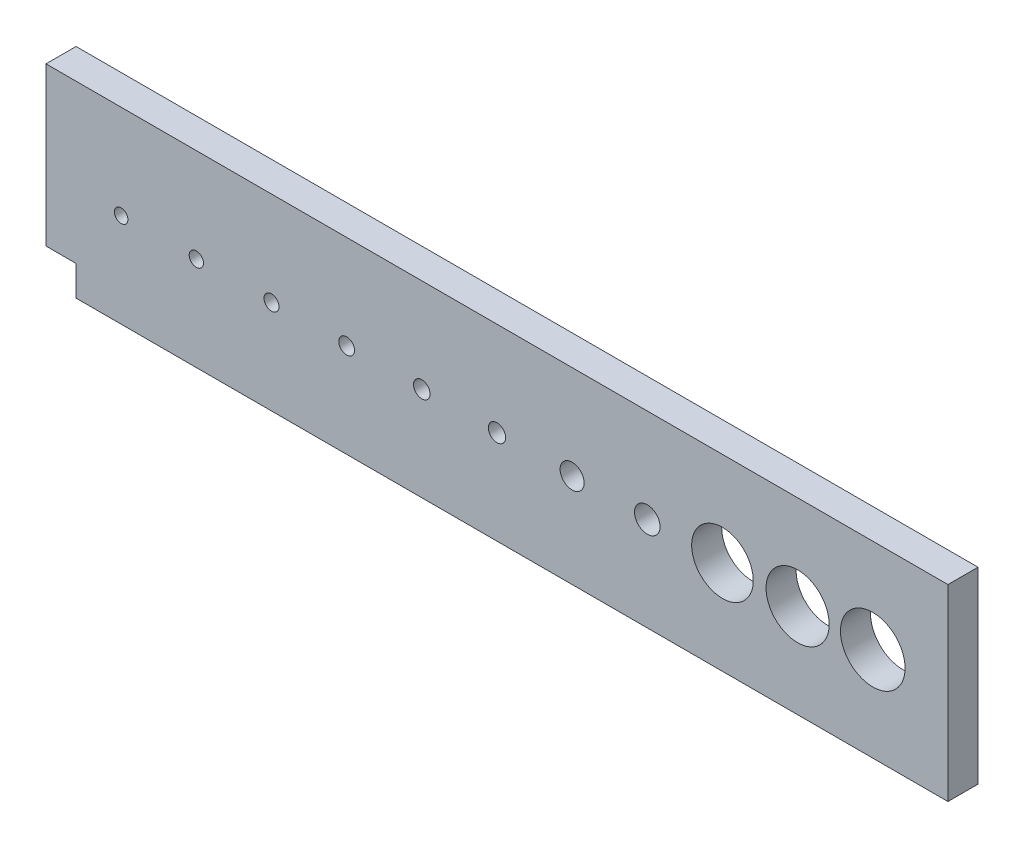
ISO-10303-21;
HEADER;
FILE_DESCRIPTION(('STEP AP214'),'2;1');
FILE_NAME('part.step','',(''),(''),'','','');
FILE_SCHEMA(('AUTOMOTIVE_DESIGN { 1 0 10303 214 1 1 1 1 }'));
ENDSEC;
DATA;
#1=APPLICATION_CONTEXT('core data for automotive mechanical design processes');
#2=APPLICATION_PROTOCOL_DEFINITION('international standard','automotive_design',2000,#1);
#3=PRODUCT_CONTEXT('',#1,'mechanical');
#4=PRODUCT('Part','Part','',(#3));
#5=PRODUCT_RELATED_PRODUCT_CATEGORY('part','',(#4));
#6=PRODUCT_DEFINITION_FORMATION('','',#4);
#7=PRODUCT_DEFINITION_CONTEXT('part definition',#1,'design');
#8=PRODUCT_DEFINITION('design','',#6,#7);
#9=PRODUCT_DEFINITION_SHAPE('','',#8);
#10=(LENGTH_UNIT() NAMED_UNIT(*) SI_UNIT(.MILLI.,.METRE.));
#11=(NAMED_UNIT(*) PLANE_ANGLE_UNIT() SI_UNIT($,.RADIAN.));
#12=(NAMED_UNIT(*) SI_UNIT($,.STERADIAN.) SOLID_ANGLE_UNIT());
#13=UNCERTAINTY_MEASURE_WITH_UNIT(LENGTH_MEASURE(1.E-05),#10,'distance_accuracy_value','');
#14=(GEOMETRIC_REPRESENTATION_CONTEXT(3) GLOBAL_UNCERTAINTY_ASSIGNED_CONTEXT((#13)) GLOBAL_UNIT_ASSIGNED_CONTEXT((#10,
#11,#12)) REPRESENTATION_CONTEXT('',''));
#15=CARTESIAN_POINT('',(0.,0.,0.));
#16=DIRECTION('',(0.,0.,1.));
#17=DIRECTION('',(1.,0.,0.));
#18=AXIS2_PLACEMENT_3D('',#15,#16,#17);
#19=CARTESIAN_POINT('',(-60.,-12.5,4.));
#20=DIRECTION('',(1.,0.,0.));
#21=DIRECTION('',(0.,0.,-1.));
#22=AXIS2_PLACEMENT_3D('',#19,#20,#21);
#23=PLANE('',#22);
#24=DIRECTION('',(0.,0.,-1.));
#25=VECTOR('',#24,1.);
#26=CARTESIAN_POINT('',(-60.,-8.5,4.1));
#27=LINE('',#26,#25);
#28=CARTESIAN_POINT('',(-60.,-8.5,4.));
#29=VERTEX_POINT('',#28);
#30=CARTESIAN_POINT('',(-60.,-8.5,0.));
#31=VERTEX_POINT('',#30);
#32=EDGE_CURVE('E57',#29,#31,#27,.T.);
#33=ORIENTED_EDGE('',*,*,#32,.F.);
#34=DIRECTION('',(0.,-1.,0.));
#35=VECTOR('',#34,1.);
#36=CARTESIAN_POINT('',(-60.,-12.5,4.));
#37=LINE('',#36,#35);
#38=CARTESIAN_POINT('',(-60.,12.5,4.));
#39=VERTEX_POINT('',#38);
#40=EDGE_CURVE('E114',#39,#29,#37,.T.);
#41=ORIENTED_EDGE('',*,*,#40,.F.);
#42=DIRECTION('',(0.,0.,-1.));
#43=VECTOR('',#42,1.);
#44=CARTESIAN_POINT('',(-60.,12.5,4.));
#45=LINE('',#44,#43);
#46=CARTESIAN_POINT('',(-60.,12.5,0.));
#47=VERTEX_POINT('',#46);
#48=EDGE_CURVE('E130',#39,#47,#45,.T.);
#49=ORIENTED_EDGE('',*,*,#48,.T.);
#50=DIRECTION('',(0.,-1.,0.));
#51=VECTOR('',#50,1.);
#52=CARTESIAN_POINT('',(-60.,-12.5,0.));
#53=LINE('',#52,#51);
#54=EDGE_CURVE('E116',#47,#31,#53,.T.);
#55=ORIENTED_EDGE('',*,*,#54,.T.);
#56=EDGE_LOOP('',(#33,#41,#49,#55));
#57=FACE_BOUND('',#56,.T.);
#58=ADVANCED_FACE('F43',(#57),#23,.F.);
#59=CARTESIAN_POINT('',(-60.,-12.5,4.));
#60=DIRECTION('',(0.,1.,0.));
#61=DIRECTION('',(0.,0.,1.));
#62=AXIS2_PLACEMENT_3D('',#59,#60,#61);
#63=PLANE('',#62);
#64=DIRECTION('',(0.,0.,-1.));
#65=VECTOR('',#64,1.);
#66=CARTESIAN_POINT('',(-56.,-12.5,4.1));
#67=LINE('',#66,#65);
#68=CARTESIAN_POINT('',(-56.,-12.5,4.));
#69=VERTEX_POINT('',#68);
#70=CARTESIAN_POINT('',(-56.,-12.5,0.));
#71=VERTEX_POINT('',#70);
#72=EDGE_CURVE('E109',#69,#71,#67,.T.);
#73=ORIENTED_EDGE('',*,*,#72,.T.);
#74=DIRECTION('',(1.,0.,0.));
#75=VECTOR('',#74,1.);
#76=CARTESIAN_POINT('',(-60.,-12.5,0.));
#77=LINE('',#76,#75);
#78=CARTESIAN_POINT('',(60.,-12.5,0.));
#79=VERTEX_POINT('',#78);
#80=EDGE_CURVE('E132',#71,#79,#77,.T.);
#81=ORIENTED_EDGE('',*,*,#80,.T.);
#82=DIRECTION('',(0.,0.,-1.));
#83=VECTOR('',#82,1.);
#84=CARTESIAN_POINT('',(60.,-12.5,4.));
#85=LINE('',#84,#83);
#86=CARTESIAN_POINT('',(60.,-12.5,4.));
#87=VERTEX_POINT('',#86);
#88=EDGE_CURVE('E138',#87,#79,#85,.T.);
#89=ORIENTED_EDGE('',*,*,#88,.F.);
#90=DIRECTION('',(1.,0.,0.));
#91=VECTOR('',#90,1.);
#92=CARTESIAN_POINT('',(-60.,-12.5,4.));
#93=LINE('',#92,#91);
#94=EDGE_CURVE('E88',#69,#87,#93,.T.);
#95=ORIENTED_EDGE('',*,*,#94,.F.);
#96=EDGE_LOOP('',(#73,#81,#89,#95));
#97=FACE_BOUND('',#96,.T.);
#98=ADVANCED_FACE('F217',(#97),#63,.F.);
#99=CARTESIAN_POINT('',(0.,0.,4.));
#100=DIRECTION('',(0.,0.,-1.));
#101=DIRECTION('',(-1.,0.,0.));
#102=AXIS2_PLACEMENT_3D('',#99,#100,#101);
#103=PLANE('',#102);
#104=CARTESIAN_POINT('',(-50.,0.,4.));
#105=DIRECTION('',(0.,0.,-1.));
#106=DIRECTION('',(-1.,0.,0.));
#107=AXIS2_PLACEMENT_3D('',#104,#105,#106);
#108=CIRCLE('',#107,0.899999999999997);
#109=CARTESIAN_POINT('',(-50.9,0.,4.));
#110=VERTEX_POINT('',#109);
#111=EDGE_CURVE('E125',#110,#110,#108,.F.);
#112=ORIENTED_EDGE('',*,*,#111,.F.);
#113=EDGE_LOOP('',(#112));
#114=FACE_BOUND('',#113,.T.);
#115=CARTESIAN_POINT('',(-40.,0.,4.));
#116=DIRECTION('',(0.,0.,-1.));
#117=DIRECTION('',(-1.,0.,0.));
#118=AXIS2_PLACEMENT_3D('',#115,#116,#117);
#119=CIRCLE('',#118,0.950000000000001);
#120=CARTESIAN_POINT('',(-40.95,0.,4.));
#121=VERTEX_POINT('',#120);
#122=EDGE_CURVE('E144',#121,#121,#119,.F.);
#123=ORIENTED_EDGE('',*,*,#122,.F.);
#124=EDGE_LOOP('',(#123));
#125=FACE_BOUND('',#124,.T.);
#126=CARTESIAN_POINT('',(-30.,0.,4.));
#127=DIRECTION('',(0.,0.,-1.));
#128=DIRECTION('',(-1.,0.,0.));
#129=AXIS2_PLACEMENT_3D('',#126,#127,#128);
#130=CIRCLE('',#129,1.);
#131=CARTESIAN_POINT('',(-31.,0.,4.));
#132=VERTEX_POINT('',#131);
#133=EDGE_CURVE('E148',#132,#132,#130,.F.);
#134=ORIENTED_EDGE('',*,*,#133,.F.);
#135=EDGE_LOOP('',(#134));
#136=FACE_BOUND('',#135,.T.);
#137=CARTESIAN_POINT('',(-20.,0.,4.));
#138=DIRECTION('',(0.,0.,-1.));
#139=DIRECTION('',(-1.,0.,0.));
#140=AXIS2_PLACEMENT_3D('',#137,#138,#139);
#141=CIRCLE('',#140,1.05);
#142=CARTESIAN_POINT('',(-21.05,0.,4.));
#143=VERTEX_POINT('',#142);
#144=EDGE_CURVE('E152',#143,#143,#141,.F.);
#145=ORIENTED_EDGE('',*,*,#144,.F.);
#146=EDGE_LOOP('',(#145));
#147=FACE_BOUND('',#146,.T.);
#148=CARTESIAN_POINT('',(-10.,0.,4.));
#149=DIRECTION('',(0.,0.,-1.));
#150=DIRECTION('',(-1.,0.,0.));
#151=AXIS2_PLACEMENT_3D('',#148,#149,#150);
#152=CIRCLE('',#151,1.1);
#153=CARTESIAN_POINT('',(-11.1,0.,4.));
#154=VERTEX_POINT('',#153);
#155=EDGE_CURVE('E156',#154,#154,#152,.F.);
#156=ORIENTED_EDGE('',*,*,#155,.F.);
#157=EDGE_LOOP('',(#156));
#158=FACE_BOUND('',#157,.T.);
#159=CARTESIAN_POINT('',(0.,0.,4.));
#160=DIRECTION('',(0.,0.,-1.));
#161=DIRECTION('',(-1.,0.,0.));
#162=AXIS2_PLACEMENT_3D('',#159,#160,#161);
#163=CIRCLE('',#162,1.15);
#164=CARTESIAN_POINT('',(-1.15,0.,4.));
#165=VERTEX_POINT('',#164);
#166=EDGE_CURVE('E160',#165,#165,#163,.F.);
#167=ORIENTED_EDGE('',*,*,#166,.F.);
#168=EDGE_LOOP('',(#167));
#169=FACE_BOUND('',#168,.T.);
#170=CARTESIAN_POINT('',(10.,0.,4.));
#171=DIRECTION('',(0.,0.,-1.));
#172=DIRECTION('',(-1.,0.,0.));
#173=AXIS2_PLACEMENT_3D('',#170,#171,#172);
#174=CIRCLE('',#173,1.6);
#175=CARTESIAN_POINT('',(8.4,0.,4.));
#176=VERTEX_POINT('',#175);
#177=EDGE_CURVE('E164',#176,#176,#174,.F.);
#178=ORIENTED_EDGE('',*,*,#177,.F.);
#179=EDGE_LOOP('',(#178));
#180=FACE_BOUND('',#179,.T.);
#181=CARTESIAN_POINT('',(20.,0.,4.));
#182=DIRECTION('',(0.,0.,-1.));
#183=DIRECTION('',(-1.,0.,0.));
#184=AXIS2_PLACEMENT_3D('',#181,#182,#183);
#185=CIRCLE('',#184,1.7);
#186=CARTESIAN_POINT('',(18.3,0.,4.));
#187=VERTEX_POINT('',#186);
#188=EDGE_CURVE('E168',#187,#187,#185,.F.);
#189=ORIENTED_EDGE('',*,*,#188,.F.);
#190=EDGE_LOOP('',(#189));
#191=FACE_BOUND('',#190,.T.);
#192=CARTESIAN_POINT('',(30.,0.,4.));
#193=DIRECTION('',(0.,0.,-1.));
#194=DIRECTION('',(-1.,0.,0.));
#195=AXIS2_PLACEMENT_3D('',#192,#193,#194);
#196=CIRCLE('',#195,4.1);
#197=CARTESIAN_POINT('',(25.9,0.,4.));
#198=VERTEX_POINT('',#197);
#199=EDGE_CURVE('E172',#198,#198,#196,.F.);
#200=ORIENTED_EDGE('',*,*,#199,.F.);
#201=EDGE_LOOP('',(#200));
#202=FACE_BOUND('',#201,.T.);
#203=CARTESIAN_POINT('',(40.,0.,4.));
#204=DIRECTION('',(0.,0.,-1.));
#205=DIRECTION('',(-1.,0.,0.));
#206=AXIS2_PLACEMENT_3D('',#203,#204,#205);
#207=CIRCLE('',#206,4.2);
#208=CARTESIAN_POINT('',(35.8,0.,4.));
#209=VERTEX_POINT('',#208);
#210=EDGE_CURVE('E176',#209,#209,#207,.F.);
#211=ORIENTED_EDGE('',*,*,#210,.F.);
#212=EDGE_LOOP('',(#211));
#213=FACE_BOUND('',#212,.T.);
#214=CARTESIAN_POINT('',(50.,0.,4.));
#215=DIRECTION('',(0.,0.,-1.));
#216=DIRECTION('',(-1.,0.,0.));
#217=AXIS2_PLACEMENT_3D('',#214,#215,#216);
#218=CIRCLE('',#217,4.3);
#219=CARTESIAN_POINT('',(45.7,0.,4.));
#220=VERTEX_POINT('',#219);
#221=EDGE_CURVE('E180',#220,#220,#218,.F.);
#222=ORIENTED_EDGE('',*,*,#221,.F.);
#223=EDGE_LOOP('',(#222));
#224=FACE_BOUND('',#223,.T.);
#225=DIRECTION('',(0.,1.,0.));
#226=VECTOR('',#225,1.);
#227=CARTESIAN_POINT('',(-56.,0.,4.));
#228=LINE('',#227,#226);
#229=CARTESIAN_POINT('',(-56.,-8.5,4.));
#230=VERTEX_POINT('',#229);
#231=EDGE_CURVE('E108',#69,#230,#228,.T.);
#232=ORIENTED_EDGE('',*,*,#231,.F.);
#233=ORIENTED_EDGE('',*,*,#94,.T.);
#234=DIRECTION('',(0.,1.,0.));
#235=VECTOR('',#234,1.);
#236=CARTESIAN_POINT('',(60.,-12.5,4.));
#237=LINE('',#236,#235);
#238=CARTESIAN_POINT('',(60.,12.5,4.));
#239=VERTEX_POINT('',#238);
#240=EDGE_CURVE('E120',#87,#239,#237,.T.);
#241=ORIENTED_EDGE('',*,*,#240,.T.);
#242=DIRECTION('',(-1.,0.,0.));
#243=VECTOR('',#242,1.);
#244=CARTESIAN_POINT('',(-60.,12.5,4.));
#245=LINE('',#244,#243);
#246=EDGE_CURVE('E66',#239,#39,#245,.T.);
#247=ORIENTED_EDGE('',*,*,#246,.T.);
#248=ORIENTED_EDGE('',*,*,#40,.T.);
#249=DIRECTION('',(-1.,0.,0.));
#250=VECTOR('',#249,1.);
#251=CARTESIAN_POINT('',(0.,-8.5,4.));
#252=LINE('',#251,#250);
#253=EDGE_CURVE('E104',#230,#29,#252,.T.);
#254=ORIENTED_EDGE('',*,*,#253,.F.);
#255=EDGE_LOOP('',(#232,#233,#241,#247,#248,#254));
#256=FACE_BOUND('',#255,.T.);
#257=ADVANCED_FACE('F118',(#114,#125,#136,#147,#158,#169,#180,#191,#202,#213,#224,#256),#103,.F.);
#258=CARTESIAN_POINT('',(0.,0.,0.));
#259=DIRECTION('',(0.,0.,-1.));
#260=DIRECTION('',(-1.,0.,0.));
#261=AXIS2_PLACEMENT_3D('',#258,#259,#260);
#262=PLANE('',#261);
#263=CARTESIAN_POINT('',(50.,0.,0.));
#264=DIRECTION('',(0.,0.,-1.));
#265=DIRECTION('',(-1.,0.,0.));
#266=AXIS2_PLACEMENT_3D('',#263,#264,#265);
#267=CIRCLE('',#266,4.3);
#268=CARTESIAN_POINT('',(45.7,0.,0.));
#269=VERTEX_POINT('',#268);
#270=EDGE_CURVE('E181',#269,#269,#267,.F.);
#271=ORIENTED_EDGE('',*,*,#270,.T.);
#272=EDGE_LOOP('',(#271));
#273=FACE_BOUND('',#272,.T.);
#274=CARTESIAN_POINT('',(40.,0.,0.));
#275=DIRECTION('',(0.,0.,-1.));
#276=DIRECTION('',(-1.,0.,0.));
#277=AXIS2_PLACEMENT_3D('',#274,#275,#276);
#278=CIRCLE('',#277,4.2);
#279=CARTESIAN_POINT('',(35.8,0.,0.));
#280=VERTEX_POINT('',#279);
#281=EDGE_CURVE('E177',#280,#280,#278,.F.);
#282=ORIENTED_EDGE('',*,*,#281,.T.);
#283=EDGE_LOOP('',(#282));
#284=FACE_BOUND('',#283,.T.);
#285=CARTESIAN_POINT('',(30.,0.,0.));
#286=DIRECTION('',(0.,0.,-1.));
#287=DIRECTION('',(-1.,0.,0.));
#288=AXIS2_PLACEMENT_3D('',#285,#286,#287);
#289=CIRCLE('',#288,4.1);
#290=CARTESIAN_POINT('',(25.9,0.,0.));
#291=VERTEX_POINT('',#290);
#292=EDGE_CURVE('E173',#291,#291,#289,.F.);
#293=ORIENTED_EDGE('',*,*,#292,.T.);
#294=EDGE_LOOP('',(#293));
#295=FACE_BOUND('',#294,.T.);
#296=CARTESIAN_POINT('',(20.,0.,0.));
#297=DIRECTION('',(0.,0.,-1.));
#298=DIRECTION('',(-1.,0.,0.));
#299=AXIS2_PLACEMENT_3D('',#296,#297,#298);
#300=CIRCLE('',#299,1.7);
#301=CARTESIAN_POINT('',(18.3,0.,0.));
#302=VERTEX_POINT('',#301);
#303=EDGE_CURVE('E169',#302,#302,#300,.F.);
#304=ORIENTED_EDGE('',*,*,#303,.T.);
#305=EDGE_LOOP('',(#304));
#306=FACE_BOUND('',#305,.T.);
#307=CARTESIAN_POINT('',(10.,0.,0.));
#308=DIRECTION('',(0.,0.,-1.));
#309=DIRECTION('',(-1.,0.,0.));
#310=AXIS2_PLACEMENT_3D('',#307,#308,#309);
#311=CIRCLE('',#310,1.6);
#312=CARTESIAN_POINT('',(8.4,0.,0.));
#313=VERTEX_POINT('',#312);
#314=EDGE_CURVE('E165',#313,#313,#311,.F.);
#315=ORIENTED_EDGE('',*,*,#314,.T.);
#316=EDGE_LOOP('',(#315));
#317=FACE_BOUND('',#316,.T.);
#318=CARTESIAN_POINT('',(0.,0.,0.));
#319=DIRECTION('',(0.,0.,-1.));
#320=DIRECTION('',(-1.,0.,0.));
#321=AXIS2_PLACEMENT_3D('',#318,#319,#320);
#322=CIRCLE('',#321,1.15);
#323=CARTESIAN_POINT('',(-1.15,0.,0.));
#324=VERTEX_POINT('',#323);
#325=EDGE_CURVE('E161',#324,#324,#322,.F.);
#326=ORIENTED_EDGE('',*,*,#325,.T.);
#327=EDGE_LOOP('',(#326));
#328=FACE_BOUND('',#327,.T.);
#329=CARTESIAN_POINT('',(-10.,0.,0.));
#330=DIRECTION('',(0.,0.,-1.));
#331=DIRECTION('',(-1.,0.,0.));
#332=AXIS2_PLACEMENT_3D('',#329,#330,#331);
#333=CIRCLE('',#332,1.1);
#334=CARTESIAN_POINT('',(-11.1,0.,0.));
#335=VERTEX_POINT('',#334);
#336=EDGE_CURVE('E157',#335,#335,#333,.F.);
#337=ORIENTED_EDGE('',*,*,#336,.T.);
#338=EDGE_LOOP('',(#337));
#339=FACE_BOUND('',#338,.T.);
#340=CARTESIAN_POINT('',(-20.,0.,0.));
#341=DIRECTION('',(0.,0.,-1.));
#342=DIRECTION('',(-1.,0.,0.));
#343=AXIS2_PLACEMENT_3D('',#340,#341,#342);
#344=CIRCLE('',#343,1.05);
#345=CARTESIAN_POINT('',(-21.05,0.,0.));
#346=VERTEX_POINT('',#345);
#347=EDGE_CURVE('E153',#346,#346,#344,.F.);
#348=ORIENTED_EDGE('',*,*,#347,.T.);
#349=EDGE_LOOP('',(#348));
#350=FACE_BOUND('',#349,.T.);
#351=CARTESIAN_POINT('',(-30.,0.,0.));
#352=DIRECTION('',(0.,0.,-1.));
#353=DIRECTION('',(-1.,0.,0.));
#354=AXIS2_PLACEMENT_3D('',#351,#352,#353);
#355=CIRCLE('',#354,1.);
#356=CARTESIAN_POINT('',(-31.,0.,0.));
#357=VERTEX_POINT('',#356);
#358=EDGE_CURVE('E149',#357,#357,#355,.F.);
#359=ORIENTED_EDGE('',*,*,#358,.T.);
#360=EDGE_LOOP('',(#359));
#361=FACE_BOUND('',#360,.T.);
#362=CARTESIAN_POINT('',(-40.,0.,0.));
#363=DIRECTION('',(0.,0.,-1.));
#364=DIRECTION('',(-1.,0.,0.));
#365=AXIS2_PLACEMENT_3D('',#362,#363,#364);
#366=CIRCLE('',#365,0.950000000000001);
#367=CARTESIAN_POINT('',(-40.95,0.,0.));
#368=VERTEX_POINT('',#367);
#369=EDGE_CURVE('E145',#368,#368,#366,.F.);
#370=ORIENTED_EDGE('',*,*,#369,.T.);
#371=EDGE_LOOP('',(#370));
#372=FACE_BOUND('',#371,.T.);
#373=CARTESIAN_POINT('',(-50.,0.,0.));
#374=DIRECTION('',(0.,0.,-1.));
#375=DIRECTION('',(-1.,0.,0.));
#376=AXIS2_PLACEMENT_3D('',#373,#374,#375);
#377=CIRCLE('',#376,0.899999999999997);
#378=CARTESIAN_POINT('',(-50.9,0.,0.));
#379=VERTEX_POINT('',#378);
#380=EDGE_CURVE('E141',#379,#379,#377,.F.);
#381=ORIENTED_EDGE('',*,*,#380,.T.);
#382=EDGE_LOOP('',(#381));
#383=FACE_BOUND('',#382,.T.);
#384=ORIENTED_EDGE('',*,*,#80,.F.);
#385=DIRECTION('',(0.,1.,0.));
#386=VECTOR('',#385,1.);
#387=CARTESIAN_POINT('',(-56.,0.,0.));
#388=LINE('',#387,#386);
#389=CARTESIAN_POINT('',(-56.,-8.5,0.));
#390=VERTEX_POINT('',#389);
#391=EDGE_CURVE('E11',#71,#390,#388,.T.);
#392=ORIENTED_EDGE('',*,*,#391,.T.);
#393=DIRECTION('',(-1.,0.,0.));
#394=VECTOR('',#393,1.);
#395=CARTESIAN_POINT('',(0.,-8.5,0.));
#396=LINE('',#395,#394);
#397=EDGE_CURVE('E50',#390,#31,#396,.T.);
#398=ORIENTED_EDGE('',*,*,#397,.T.);
#399=ORIENTED_EDGE('',*,*,#54,.F.);
#400=DIRECTION('',(-1.,0.,0.));
#401=VECTOR('',#400,1.);
#402=CARTESIAN_POINT('',(-60.,12.5,0.));
#403=LINE('',#402,#401);
#404=CARTESIAN_POINT('',(60.,12.5,0.));
#405=VERTEX_POINT('',#404);
#406=EDGE_CURVE('E83',#405,#47,#403,.T.);
#407=ORIENTED_EDGE('',*,*,#406,.F.);
#408=DIRECTION('',(0.,1.,0.));
#409=VECTOR('',#408,1.);
#410=CARTESIAN_POINT('',(60.,-12.5,0.));
#411=LINE('',#410,#409);
#412=EDGE_CURVE('E122',#79,#405,#411,.T.);
#413=ORIENTED_EDGE('',*,*,#412,.F.);
#414=EDGE_LOOP('',(#384,#392,#398,#399,#407,#413));
#415=FACE_BOUND('',#414,.T.);
#416=ADVANCED_FACE('F185',(#273,#284,#295,#306,#317,#328,#339,#350,#361,#372,#383,#415),#262,.T.);
#417=CARTESIAN_POINT('',(60.,-12.5,4.));
#418=DIRECTION('',(-1.,0.,0.));
#419=DIRECTION('',(0.,0.,1.));
#420=AXIS2_PLACEMENT_3D('',#417,#418,#419);
#421=PLANE('',#420);
#422=ORIENTED_EDGE('',*,*,#412,.T.);
#423=DIRECTION('',(0.,0.,-1.));
#424=VECTOR('',#423,1.);
#425=CARTESIAN_POINT('',(60.,12.5,4.));
#426=LINE('',#425,#424);
#427=EDGE_CURVE('E136',#239,#405,#426,.T.);
#428=ORIENTED_EDGE('',*,*,#427,.F.);
#429=ORIENTED_EDGE('',*,*,#240,.F.);
#430=ORIENTED_EDGE('',*,*,#88,.T.);
#431=EDGE_LOOP('',(#422,#428,#429,#430));
#432=FACE_BOUND('',#431,.T.);
#433=ADVANCED_FACE('F260',(#432),#421,.F.);
#434=CARTESIAN_POINT('',(-60.,12.5,4.));
#435=DIRECTION('',(0.,-1.,0.));
#436=DIRECTION('',(0.,0.,-1.));
#437=AXIS2_PLACEMENT_3D('',#434,#435,#436);
#438=PLANE('',#437);
#439=ORIENTED_EDGE('',*,*,#406,.T.);
#440=ORIENTED_EDGE('',*,*,#48,.F.);
#441=ORIENTED_EDGE('',*,*,#246,.F.);
#442=ORIENTED_EDGE('',*,*,#427,.T.);
#443=EDGE_LOOP('',(#439,#440,#441,#442));
#444=FACE_BOUND('',#443,.T.);
#445=ADVANCED_FACE('F263',(#444),#438,.F.);
#446=CARTESIAN_POINT('',(-50.,0.,4.1));
#447=DIRECTION('',(0.,0.,-1.));
#448=DIRECTION('',(-1.,0.,0.));
#449=AXIS2_PLACEMENT_3D('',#446,#447,#448);
#450=CYLINDRICAL_SURFACE('',#449,0.899999999999997);
#451=ORIENTED_EDGE('',*,*,#380,.F.);
#452=EDGE_LOOP('',(#451));
#453=FACE_BOUND('',#452,.T.);
#454=ORIENTED_EDGE('',*,*,#111,.T.);
#455=EDGE_LOOP('',(#454));
#456=FACE_BOUND('',#455,.T.);
#457=ADVANCED_FACE('F267',(#453,#456),#450,.F.);
#458=CARTESIAN_POINT('',(-40.,0.,4.1));
#459=DIRECTION('',(0.,0.,-1.));
#460=DIRECTION('',(-1.,0.,0.));
#461=AXIS2_PLACEMENT_3D('',#458,#459,#460);
#462=CYLINDRICAL_SURFACE('',#461,0.950000000000001);
#463=ORIENTED_EDGE('',*,*,#369,.F.);
#464=EDGE_LOOP('',(#463));
#465=FACE_BOUND('',#464,.T.);
#466=ORIENTED_EDGE('',*,*,#122,.T.);
#467=EDGE_LOOP('',(#466));
#468=FACE_BOUND('',#467,.T.);
#469=ADVANCED_FACE('F213',(#465,#468),#462,.F.);
#470=CARTESIAN_POINT('',(-30.,0.,4.1));
#471=DIRECTION('',(0.,0.,-1.));
#472=DIRECTION('',(-1.,0.,0.));
#473=AXIS2_PLACEMENT_3D('',#470,#471,#472);
#474=CYLINDRICAL_SURFACE('',#473,1.);
#475=ORIENTED_EDGE('',*,*,#358,.F.);
#476=EDGE_LOOP('',(#475));
#477=FACE_BOUND('',#476,.T.);
#478=ORIENTED_EDGE('',*,*,#133,.T.);
#479=EDGE_LOOP('',(#478));
#480=FACE_BOUND('',#479,.T.);
#481=ADVANCED_FACE('F276',(#477,#480),#474,.F.);
#482=CARTESIAN_POINT('',(-20.,0.,4.1));
#483=DIRECTION('',(0.,0.,-1.));
#484=DIRECTION('',(-1.,0.,0.));
#485=AXIS2_PLACEMENT_3D('',#482,#483,#484);
#486=CYLINDRICAL_SURFACE('',#485,1.05);
#487=ORIENTED_EDGE('',*,*,#347,.F.);
#488=EDGE_LOOP('',(#487));
#489=FACE_BOUND('',#488,.T.);
#490=ORIENTED_EDGE('',*,*,#144,.T.);
#491=EDGE_LOOP('',(#490));
#492=FACE_BOUND('',#491,.T.);
#493=ADVANCED_FACE('F280',(#489,#492),#486,.F.);
#494=CARTESIAN_POINT('',(-10.,0.,4.1));
#495=DIRECTION('',(0.,0.,-1.));
#496=DIRECTION('',(-1.,0.,0.));
#497=AXIS2_PLACEMENT_3D('',#494,#495,#496);
#498=CYLINDRICAL_SURFACE('',#497,1.1);
#499=ORIENTED_EDGE('',*,*,#336,.F.);
#500=EDGE_LOOP('',(#499));
#501=FACE_BOUND('',#500,.T.);
#502=ORIENTED_EDGE('',*,*,#155,.T.);
#503=EDGE_LOOP('',(#502));
#504=FACE_BOUND('',#503,.T.);
#505=ADVANCED_FACE('F284',(#501,#504),#498,.F.);
#506=CARTESIAN_POINT('',(0.,0.,4.1));
#507=DIRECTION('',(0.,0.,-1.));
#508=DIRECTION('',(-1.,0.,0.));
#509=AXIS2_PLACEMENT_3D('',#506,#507,#508);
#510=CYLINDRICAL_SURFACE('',#509,1.15);
#511=ORIENTED_EDGE('',*,*,#325,.F.);
#512=EDGE_LOOP('',(#511));
#513=FACE_BOUND('',#512,.T.);
#514=ORIENTED_EDGE('',*,*,#166,.T.);
#515=EDGE_LOOP('',(#514));
#516=FACE_BOUND('',#515,.T.);
#517=ADVANCED_FACE('F288',(#513,#516),#510,.F.);
#518=CARTESIAN_POINT('',(10.,0.,4.1));
#519=DIRECTION('',(0.,0.,-1.));
#520=DIRECTION('',(-1.,0.,0.));
#521=AXIS2_PLACEMENT_3D('',#518,#519,#520);
#522=CYLINDRICAL_SURFACE('',#521,1.6);
#523=ORIENTED_EDGE('',*,*,#314,.F.);
#524=EDGE_LOOP('',(#523));
#525=FACE_BOUND('',#524,.T.);
#526=ORIENTED_EDGE('',*,*,#177,.T.);
#527=EDGE_LOOP('',(#526));
#528=FACE_BOUND('',#527,.T.);
#529=ADVANCED_FACE('F292',(#525,#528),#522,.F.);
#530=CARTESIAN_POINT('',(20.,0.,4.1));
#531=DIRECTION('',(0.,0.,-1.));
#532=DIRECTION('',(-1.,0.,0.));
#533=AXIS2_PLACEMENT_3D('',#530,#531,#532);
#534=CYLINDRICAL_SURFACE('',#533,1.7);
#535=ORIENTED_EDGE('',*,*,#303,.F.);
#536=EDGE_LOOP('',(#535));
#537=FACE_BOUND('',#536,.T.);
#538=ORIENTED_EDGE('',*,*,#188,.T.);
#539=EDGE_LOOP('',(#538));
#540=FACE_BOUND('',#539,.T.);
#541=ADVANCED_FACE('F296',(#537,#540),#534,.F.);
#542=CARTESIAN_POINT('',(30.,0.,4.1));
#543=DIRECTION('',(0.,0.,-1.));
#544=DIRECTION('',(-1.,0.,0.));
#545=AXIS2_PLACEMENT_3D('',#542,#543,#544);
#546=CYLINDRICAL_SURFACE('',#545,4.1);
#547=ORIENTED_EDGE('',*,*,#292,.F.);
#548=EDGE_LOOP('',(#547));
#549=FACE_BOUND('',#548,.T.);
#550=ORIENTED_EDGE('',*,*,#199,.T.);
#551=EDGE_LOOP('',(#550));
#552=FACE_BOUND('',#551,.T.);
#553=ADVANCED_FACE('F249',(#549,#552),#546,.F.);
#554=CARTESIAN_POINT('',(40.,0.,4.1));
#555=DIRECTION('',(0.,0.,-1.));
#556=DIRECTION('',(-1.,0.,0.));
#557=AXIS2_PLACEMENT_3D('',#554,#555,#556);
#558=CYLINDRICAL_SURFACE('',#557,4.2);
#559=ORIENTED_EDGE('',*,*,#281,.F.);
#560=EDGE_LOOP('',(#559));
#561=FACE_BOUND('',#560,.T.);
#562=ORIENTED_EDGE('',*,*,#210,.T.);
#563=EDGE_LOOP('',(#562));
#564=FACE_BOUND('',#563,.T.);
#565=ADVANCED_FACE('F240',(#561,#564),#558,.F.);
#566=CARTESIAN_POINT('',(50.,0.,4.1));
#567=DIRECTION('',(0.,0.,-1.));
#568=DIRECTION('',(-1.,0.,0.));
#569=AXIS2_PLACEMENT_3D('',#566,#567,#568);
#570=CYLINDRICAL_SURFACE('',#569,4.3);
#571=ORIENTED_EDGE('',*,*,#270,.F.);
#572=EDGE_LOOP('',(#571));
#573=FACE_BOUND('',#572,.T.);
#574=ORIENTED_EDGE('',*,*,#221,.T.);
#575=EDGE_LOOP('',(#574));
#576=FACE_BOUND('',#575,.T.);
#577=ADVANCED_FACE('F238',(#573,#576),#570,.F.);
#578=CARTESIAN_POINT('',(-56.,-12.5,4.1));
#579=DIRECTION('',(-1.,0.,0.));
#580=DIRECTION('',(0.,0.,1.));
#581=AXIS2_PLACEMENT_3D('',#578,#579,#580);
#582=PLANE('',#581);
#583=ORIENTED_EDGE('',*,*,#231,.T.);
#584=DIRECTION('',(0.,0.,-1.));
#585=VECTOR('',#584,1.);
#586=CARTESIAN_POINT('',(-56.,-8.5,4.1));
#587=LINE('',#586,#585);
#588=EDGE_CURVE('E107',#230,#390,#587,.T.);
#589=ORIENTED_EDGE('',*,*,#588,.T.);
#590=ORIENTED_EDGE('',*,*,#391,.F.);
#591=ORIENTED_EDGE('',*,*,#72,.F.);
#592=EDGE_LOOP('',(#583,#589,#590,#591));
#593=FACE_BOUND('',#592,.T.);
#594=ADVANCED_FACE('F187',(#593),#582,.T.);
#595=CARTESIAN_POINT('',(-60.,-8.5,4.1));
#596=DIRECTION('',(0.,-1.,0.));
#597=DIRECTION('',(0.,0.,-1.));
#598=AXIS2_PLACEMENT_3D('',#595,#596,#597);
#599=PLANE('',#598);
#600=ORIENTED_EDGE('',*,*,#253,.T.);
#601=ORIENTED_EDGE('',*,*,#32,.T.);
#602=ORIENTED_EDGE('',*,*,#397,.F.);
#603=ORIENTED_EDGE('',*,*,#588,.F.);
#604=EDGE_LOOP('',(#600,#601,#602,#603));
#605=FACE_BOUND('',#604,.T.);
#606=ADVANCED_FACE('F105',(#605),#599,.T.);
#607=CLOSED_SHELL('',(#58,#98,#257,#416,#433,#445,#457,#469,#481,#493,#505,#517,#529,#541,#553,
#565,#577,#594,#606));
#608=MANIFOLD_SOLID_BREP('B2',#607);
#609=ADVANCED_BREP_SHAPE_REPRESENTATION('',(#18,#608),#14);
#610=SHAPE_DEFINITION_REPRESENTATION(#9,#609);
ENDSEC;
END-ISO-10303-21;
